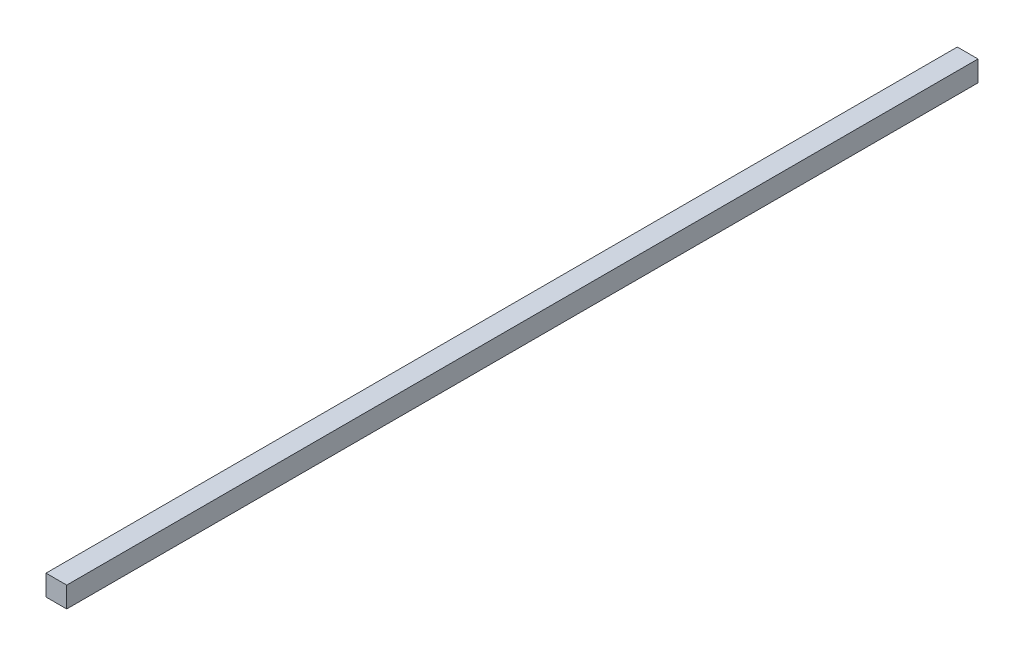
ISO-10303-21;
HEADER;
FILE_DESCRIPTION(('STEP AP214'),'2;1');
FILE_NAME('part.step','',(''),(''),'','','');
FILE_SCHEMA(('AUTOMOTIVE_DESIGN { 1 0 10303 214 1 1 1 1 }'));
ENDSEC;
DATA;
#1=APPLICATION_CONTEXT('core data for automotive mechanical design processes');
#2=APPLICATION_PROTOCOL_DEFINITION('international standard','automotive_design',2000,#1);
#3=PRODUCT_CONTEXT('',#1,'mechanical');
#4=PRODUCT('Part','Part','',(#3));
#5=PRODUCT_RELATED_PRODUCT_CATEGORY('part','',(#4));
#6=PRODUCT_DEFINITION_FORMATION('','',#4);
#7=PRODUCT_DEFINITION_CONTEXT('part definition',#1,'design');
#8=PRODUCT_DEFINITION('design','',#6,#7);
#9=PRODUCT_DEFINITION_SHAPE('','',#8);
#10=(LENGTH_UNIT() NAMED_UNIT(*) SI_UNIT(.MILLI.,.METRE.));
#11=(NAMED_UNIT(*) PLANE_ANGLE_UNIT() SI_UNIT($,.RADIAN.));
#12=(NAMED_UNIT(*) SI_UNIT($,.STERADIAN.) SOLID_ANGLE_UNIT());
#13=UNCERTAINTY_MEASURE_WITH_UNIT(LENGTH_MEASURE(1.E-05),#10,'distance_accuracy_value','');
#14=(GEOMETRIC_REPRESENTATION_CONTEXT(3) GLOBAL_UNCERTAINTY_ASSIGNED_CONTEXT((#13)) GLOBAL_UNIT_ASSIGNED_CONTEXT((#10,
#11,#12)) REPRESENTATION_CONTEXT('',''));
#15=CARTESIAN_POINT('',(0.,0.,0.));
#16=DIRECTION('',(0.,0.,1.));
#17=DIRECTION('',(1.,0.,0.));
#18=AXIS2_PLACEMENT_3D('',#15,#16,#17);
#19=CARTESIAN_POINT('',(5.,5.,440.));
#20=DIRECTION('',(-1.,0.,0.));
#21=DIRECTION('',(0.,-1.,0.));
#22=AXIS2_PLACEMENT_3D('',#19,#20,#21);
#23=PLANE('',#22);
#24=DIRECTION('',(0.,1.,0.));
#25=VECTOR('',#24,1.);
#26=CARTESIAN_POINT('',(5.,5.,0.));
#27=LINE('',#26,#25);
#28=CARTESIAN_POINT('',(5.,-5.,0.));
#29=VERTEX_POINT('',#28);
#30=CARTESIAN_POINT('',(5.,5.,0.));
#31=VERTEX_POINT('',#30);
#32=EDGE_CURVE('E98',#29,#31,#27,.T.);
#33=ORIENTED_EDGE('',*,*,#32,.T.);
#34=DIRECTION('',(0.,0.,-1.));
#35=VECTOR('',#34,1.);
#36=CARTESIAN_POINT('',(5.,5.,440.));
#37=LINE('',#36,#35);
#38=CARTESIAN_POINT('',(5.,5.,440.));
#39=VERTEX_POINT('',#38);
#40=EDGE_CURVE('E11',#39,#31,#37,.T.);
#41=ORIENTED_EDGE('',*,*,#40,.F.);
#42=DIRECTION('',(0.,1.,0.));
#43=VECTOR('',#42,1.);
#44=CARTESIAN_POINT('',(5.,5.,440.));
#45=LINE('',#44,#43);
#46=CARTESIAN_POINT('',(5.,-5.,440.));
#47=VERTEX_POINT('',#46);
#48=EDGE_CURVE('E86',#47,#39,#45,.T.);
#49=ORIENTED_EDGE('',*,*,#48,.F.);
#50=DIRECTION('',(0.,0.,-1.));
#51=VECTOR('',#50,1.);
#52=CARTESIAN_POINT('',(5.,-5.,440.));
#53=LINE('',#52,#51);
#54=EDGE_CURVE('E94',#47,#29,#53,.T.);
#55=ORIENTED_EDGE('',*,*,#54,.T.);
#56=EDGE_LOOP('',(#33,#41,#49,#55));
#57=FACE_BOUND('',#56,.T.);
#58=ADVANCED_FACE('F35',(#57),#23,.F.);
#59=CARTESIAN_POINT('',(-5.,5.,440.));
#60=DIRECTION('',(0.,-1.,0.));
#61=DIRECTION('',(0.,0.,-1.));
#62=AXIS2_PLACEMENT_3D('',#59,#60,#61);
#63=PLANE('',#62);
#64=DIRECTION('',(-1.,0.,0.));
#65=VECTOR('',#64,1.);
#66=CARTESIAN_POINT('',(-5.,5.,0.));
#67=LINE('',#66,#65);
#68=CARTESIAN_POINT('',(-5.,5.,0.));
#69=VERTEX_POINT('',#68);
#70=EDGE_CURVE('E90',#31,#69,#67,.T.);
#71=ORIENTED_EDGE('',*,*,#70,.T.);
#72=DIRECTION('',(0.,0.,-1.));
#73=VECTOR('',#72,1.);
#74=CARTESIAN_POINT('',(-5.,5.,440.));
#75=LINE('',#74,#73);
#76=CARTESIAN_POINT('',(-5.,5.,440.));
#77=VERTEX_POINT('',#76);
#78=EDGE_CURVE('E43',#77,#69,#75,.T.);
#79=ORIENTED_EDGE('',*,*,#78,.F.);
#80=DIRECTION('',(-1.,0.,0.));
#81=VECTOR('',#80,1.);
#82=CARTESIAN_POINT('',(-5.,5.,440.));
#83=LINE('',#82,#81);
#84=EDGE_CURVE('E81',#39,#77,#83,.T.);
#85=ORIENTED_EDGE('',*,*,#84,.F.);
#86=ORIENTED_EDGE('',*,*,#40,.T.);
#87=EDGE_LOOP('',(#71,#79,#85,#86));
#88=FACE_BOUND('',#87,.T.);
#89=ADVANCED_FACE('F89',(#88),#63,.F.);
#90=CARTESIAN_POINT('',(-5.,5.,440.));
#91=DIRECTION('',(1.,0.,0.));
#92=DIRECTION('',(0.,1.,0.));
#93=AXIS2_PLACEMENT_3D('',#90,#91,#92);
#94=PLANE('',#93);
#95=DIRECTION('',(0.,-1.,0.));
#96=VECTOR('',#95,1.);
#97=CARTESIAN_POINT('',(-5.,5.,0.));
#98=LINE('',#97,#96);
#99=CARTESIAN_POINT('',(-5.,-5.,0.));
#100=VERTEX_POINT('',#99);
#101=EDGE_CURVE('E68',#69,#100,#98,.T.);
#102=ORIENTED_EDGE('',*,*,#101,.T.);
#103=DIRECTION('',(0.,0.,-1.));
#104=VECTOR('',#103,1.);
#105=CARTESIAN_POINT('',(-5.,-5.,440.));
#106=LINE('',#105,#104);
#107=CARTESIAN_POINT('',(-5.,-5.,440.));
#108=VERTEX_POINT('',#107);
#109=EDGE_CURVE('E91',#108,#100,#106,.T.);
#110=ORIENTED_EDGE('',*,*,#109,.F.);
#111=DIRECTION('',(0.,-1.,0.));
#112=VECTOR('',#111,1.);
#113=CARTESIAN_POINT('',(-5.,5.,440.));
#114=LINE('',#113,#112);
#115=EDGE_CURVE('E84',#77,#108,#114,.T.);
#116=ORIENTED_EDGE('',*,*,#115,.F.);
#117=ORIENTED_EDGE('',*,*,#78,.T.);
#118=EDGE_LOOP('',(#102,#110,#116,#117));
#119=FACE_BOUND('',#118,.T.);
#120=ADVANCED_FACE('F92',(#119),#94,.F.);
#121=CARTESIAN_POINT('',(-5.,-5.,440.));
#122=DIRECTION('',(0.,1.,0.));
#123=DIRECTION('',(0.,0.,1.));
#124=AXIS2_PLACEMENT_3D('',#121,#122,#123);
#125=PLANE('',#124);
#126=DIRECTION('',(1.,0.,0.));
#127=VECTOR('',#126,1.);
#128=CARTESIAN_POINT('',(-5.,-5.,0.));
#129=LINE('',#128,#127);
#130=EDGE_CURVE('E74',#100,#29,#129,.T.);
#131=ORIENTED_EDGE('',*,*,#130,.T.);
#132=ORIENTED_EDGE('',*,*,#54,.F.);
#133=DIRECTION('',(1.,0.,0.));
#134=VECTOR('',#133,1.);
#135=CARTESIAN_POINT('',(-5.,-5.,440.));
#136=LINE('',#135,#134);
#137=EDGE_CURVE('E51',#108,#47,#136,.T.);
#138=ORIENTED_EDGE('',*,*,#137,.F.);
#139=ORIENTED_EDGE('',*,*,#109,.T.);
#140=EDGE_LOOP('',(#131,#132,#138,#139));
#141=FACE_BOUND('',#140,.T.);
#142=ADVANCED_FACE('F105',(#141),#125,.F.);
#143=CARTESIAN_POINT('',(0.,0.,440.));
#144=DIRECTION('',(0.,0.,1.));
#145=DIRECTION('',(1.,0.,0.));
#146=AXIS2_PLACEMENT_3D('',#143,#144,#145);
#147=PLANE('',#146);
#148=ORIENTED_EDGE('',*,*,#48,.T.);
#149=ORIENTED_EDGE('',*,*,#84,.T.);
#150=ORIENTED_EDGE('',*,*,#115,.T.);
#151=ORIENTED_EDGE('',*,*,#137,.T.);
#152=EDGE_LOOP('',(#148,#149,#150,#151));
#153=FACE_BOUND('',#152,.T.);
#154=ADVANCED_FACE('F82',(#153),#147,.T.);
#155=CARTESIAN_POINT('',(0.,0.,0.));
#156=DIRECTION('',(0.,0.,1.));
#157=DIRECTION('',(1.,0.,0.));
#158=AXIS2_PLACEMENT_3D('',#155,#156,#157);
#159=PLANE('',#158);
#160=ORIENTED_EDGE('',*,*,#32,.F.);
#161=ORIENTED_EDGE('',*,*,#130,.F.);
#162=ORIENTED_EDGE('',*,*,#101,.F.);
#163=ORIENTED_EDGE('',*,*,#70,.F.);
#164=EDGE_LOOP('',(#160,#161,#162,#163));
#165=FACE_BOUND('',#164,.T.);
#166=ADVANCED_FACE('F108',(#165),#159,.F.);
#167=CLOSED_SHELL('',(#58,#89,#120,#142,#154,#166));
#168=MANIFOLD_SOLID_BREP('B2',#167);
#169=ADVANCED_BREP_SHAPE_REPRESENTATION('',(#18,#168),#14);
#170=SHAPE_DEFINITION_REPRESENTATION(#9,#169);
ENDSEC;
END-ISO-10303-21;
